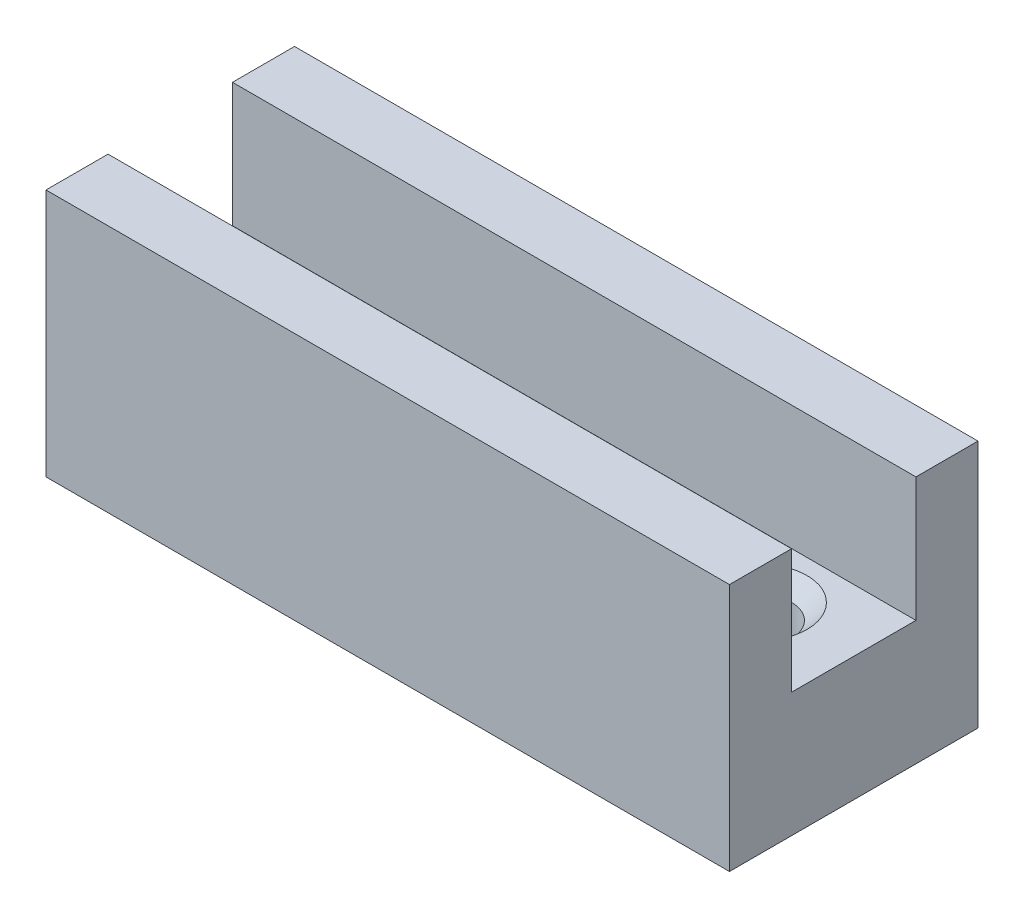
ISO-10303-21;
HEADER;
FILE_DESCRIPTION(('STEP AP214'),'2;1');
FILE_NAME('part.step','',(''),(''),'','','');
FILE_SCHEMA(('AUTOMOTIVE_DESIGN { 1 0 10303 214 1 1 1 1 }'));
ENDSEC;
DATA;
#1=APPLICATION_CONTEXT('core data for automotive mechanical design processes');
#2=APPLICATION_PROTOCOL_DEFINITION('international standard','automotive_design',2000,#1);
#3=PRODUCT_CONTEXT('',#1,'mechanical');
#4=PRODUCT('Part','Part','',(#3));
#5=PRODUCT_RELATED_PRODUCT_CATEGORY('part','',(#4));
#6=PRODUCT_DEFINITION_FORMATION('','',#4);
#7=PRODUCT_DEFINITION_CONTEXT('part definition',#1,'design');
#8=PRODUCT_DEFINITION('design','',#6,#7);
#9=PRODUCT_DEFINITION_SHAPE('','',#8);
#10=(LENGTH_UNIT() NAMED_UNIT(*) SI_UNIT(.MILLI.,.METRE.));
#11=(NAMED_UNIT(*) PLANE_ANGLE_UNIT() SI_UNIT($,.RADIAN.));
#12=(NAMED_UNIT(*) SI_UNIT($,.STERADIAN.) SOLID_ANGLE_UNIT());
#13=UNCERTAINTY_MEASURE_WITH_UNIT(LENGTH_MEASURE(1.E-05),#10,'distance_accuracy_value','');
#14=(GEOMETRIC_REPRESENTATION_CONTEXT(3) GLOBAL_UNCERTAINTY_ASSIGNED_CONTEXT((#13)) GLOBAL_UNIT_ASSIGNED_CONTEXT((#10,
#11,#12)) REPRESENTATION_CONTEXT('',''));
#15=CARTESIAN_POINT('',(0.,0.,0.));
#16=DIRECTION('',(0.,0.,1.));
#17=DIRECTION('',(1.,0.,0.));
#18=AXIS2_PLACEMENT_3D('',#15,#16,#17);
#19=CARTESIAN_POINT('',(0.,0.,101.6));
#20=DIRECTION('',(1.,0.,0.));
#21=DIRECTION('',(0.,0.,-1.));
#22=AXIS2_PLACEMENT_3D('',#19,#20,#21);
#23=PLANE('',#22);
#24=DIRECTION('',(0.,1.,0.));
#25=VECTOR('',#24,1.);
#26=CARTESIAN_POINT('',(0.,50.8,76.2340316643868));
#27=LINE('',#26,#25);
#28=CARTESIAN_POINT('',(0.,50.8,76.2340316643868));
#29=VERTEX_POINT('',#28);
#30=CARTESIAN_POINT('',(0.,101.6,76.2340316643868));
#31=VERTEX_POINT('',#30);
#32=EDGE_CURVE('E141',#29,#31,#27,.T.);
#33=ORIENTED_EDGE('',*,*,#32,.F.);
#34=DIRECTION('',(0.,0.,1.));
#35=VECTOR('',#34,1.);
#36=CARTESIAN_POINT('',(0.,50.8,0.));
#37=LINE('',#36,#35);
#38=CARTESIAN_POINT('',(0.,50.8,25.3659683356124));
#39=VERTEX_POINT('',#38);
#40=EDGE_CURVE('E119',#39,#29,#37,.T.);
#41=ORIENTED_EDGE('',*,*,#40,.F.);
#42=DIRECTION('',(0.,1.,0.));
#43=VECTOR('',#42,1.);
#44=CARTESIAN_POINT('',(0.,50.8,25.3659683356124));
#45=LINE('',#44,#43);
#46=CARTESIAN_POINT('',(0.,101.6,25.3659683356124));
#47=VERTEX_POINT('',#46);
#48=EDGE_CURVE('E144',#39,#47,#45,.T.);
#49=ORIENTED_EDGE('',*,*,#48,.T.);
#50=DIRECTION('',(0.,0.,-1.));
#51=VECTOR('',#50,1.);
#52=CARTESIAN_POINT('',(0.,101.6,101.6));
#53=LINE('',#52,#51);
#54=CARTESIAN_POINT('',(0.,101.6,0.));
#55=VERTEX_POINT('',#54);
#56=EDGE_CURVE('E79',#47,#55,#53,.T.);
#57=ORIENTED_EDGE('',*,*,#56,.T.);
#58=DIRECTION('',(0.,-1.,0.));
#59=VECTOR('',#58,1.);
#60=CARTESIAN_POINT('',(0.,0.,0.));
#61=LINE('',#60,#59);
#62=CARTESIAN_POINT('',(0.,0.,0.));
#63=VERTEX_POINT('',#62);
#64=EDGE_CURVE('E143',#55,#63,#61,.T.);
#65=ORIENTED_EDGE('',*,*,#64,.T.);
#66=DIRECTION('',(0.,0.,-1.));
#67=VECTOR('',#66,1.);
#68=CARTESIAN_POINT('',(0.,0.,101.6));
#69=LINE('',#68,#67);
#70=CARTESIAN_POINT('',(0.,0.,101.6));
#71=VERTEX_POINT('',#70);
#72=EDGE_CURVE('E170',#71,#63,#69,.T.);
#73=ORIENTED_EDGE('',*,*,#72,.F.);
#74=DIRECTION('',(0.,-1.,0.));
#75=VECTOR('',#74,1.);
#76=CARTESIAN_POINT('',(0.,0.,101.6));
#77=LINE('',#76,#75);
#78=CARTESIAN_POINT('',(0.,101.6,101.6));
#79=VERTEX_POINT('',#78);
#80=EDGE_CURVE('E147',#79,#71,#77,.T.);
#81=ORIENTED_EDGE('',*,*,#80,.F.);
#82=EDGE_CURVE('E161',#79,#31,#53,.T.);
#83=ORIENTED_EDGE('',*,*,#82,.T.);
#84=EDGE_LOOP('',(#33,#41,#49,#57,#65,#73,#81,#83));
#85=FACE_BOUND('',#84,.T.);
#86=ADVANCED_FACE('F33',(#85),#23,.F.);
#87=CARTESIAN_POINT('',(279.4,0.,101.6));
#88=DIRECTION('',(-1.,0.,0.));
#89=DIRECTION('',(0.,0.,1.));
#90=AXIS2_PLACEMENT_3D('',#87,#88,#89);
#91=PLANE('',#90);
#92=DIRECTION('',(0.,1.,0.));
#93=VECTOR('',#92,1.);
#94=CARTESIAN_POINT('',(279.4,50.8,76.2340316643868));
#95=LINE('',#94,#93);
#96=CARTESIAN_POINT('',(279.4,50.8,76.2340316643868));
#97=VERTEX_POINT('',#96);
#98=CARTESIAN_POINT('',(279.4,101.6,76.2340316643868));
#99=VERTEX_POINT('',#98);
#100=EDGE_CURVE('E108',#97,#99,#95,.T.);
#101=ORIENTED_EDGE('',*,*,#100,.T.);
#102=DIRECTION('',(0.,0.,-1.));
#103=VECTOR('',#102,1.);
#104=CARTESIAN_POINT('',(279.4,101.6,101.6));
#105=LINE('',#104,#103);
#106=CARTESIAN_POINT('',(279.4,101.6,101.6));
#107=VERTEX_POINT('',#106);
#108=EDGE_CURVE('E165',#107,#99,#105,.T.);
#109=ORIENTED_EDGE('',*,*,#108,.F.);
#110=DIRECTION('',(0.,1.,0.));
#111=VECTOR('',#110,1.);
#112=CARTESIAN_POINT('',(279.4,0.,101.6));
#113=LINE('',#112,#111);
#114=CARTESIAN_POINT('',(279.4,0.,101.6));
#115=VERTEX_POINT('',#114);
#116=EDGE_CURVE('E151',#115,#107,#113,.T.);
#117=ORIENTED_EDGE('',*,*,#116,.F.);
#118=DIRECTION('',(0.,0.,-1.));
#119=VECTOR('',#118,1.);
#120=CARTESIAN_POINT('',(279.4,0.,101.6));
#121=LINE('',#120,#119);
#122=CARTESIAN_POINT('',(279.4,0.,0.));
#123=VERTEX_POINT('',#122);
#124=EDGE_CURVE('E167',#115,#123,#121,.T.);
#125=ORIENTED_EDGE('',*,*,#124,.T.);
#126=DIRECTION('',(0.,1.,0.));
#127=VECTOR('',#126,1.);
#128=CARTESIAN_POINT('',(279.4,0.,0.));
#129=LINE('',#128,#127);
#130=CARTESIAN_POINT('',(279.4,101.6,0.));
#131=VERTEX_POINT('',#130);
#132=EDGE_CURVE('E157',#123,#131,#129,.T.);
#133=ORIENTED_EDGE('',*,*,#132,.T.);
#134=CARTESIAN_POINT('',(279.4,101.6,25.3659683356124));
#135=VERTEX_POINT('',#134);
#136=EDGE_CURVE('E164',#135,#131,#105,.T.);
#137=ORIENTED_EDGE('',*,*,#136,.F.);
#138=DIRECTION('',(0.,1.,0.));
#139=VECTOR('',#138,1.);
#140=CARTESIAN_POINT('',(279.4,50.8,25.3659683356124));
#141=LINE('',#140,#139);
#142=CARTESIAN_POINT('',(279.4,50.8,25.3659683356124));
#143=VERTEX_POINT('',#142);
#144=EDGE_CURVE('E48',#143,#135,#141,.T.);
#145=ORIENTED_EDGE('',*,*,#144,.F.);
#146=DIRECTION('',(0.,0.,-1.));
#147=VECTOR('',#146,1.);
#148=CARTESIAN_POINT('',(279.4,50.8,0.));
#149=LINE('',#148,#147);
#150=EDGE_CURVE('E125',#97,#143,#149,.T.);
#151=ORIENTED_EDGE('',*,*,#150,.F.);
#152=EDGE_LOOP('',(#101,#109,#117,#125,#133,#137,#145,#151));
#153=FACE_BOUND('',#152,.T.);
#154=ADVANCED_FACE('F130',(#153),#91,.F.);
#155=CARTESIAN_POINT('',(0.,101.6,101.6));
#156=DIRECTION('',(0.,-1.,0.));
#157=DIRECTION('',(0.,0.,-1.));
#158=AXIS2_PLACEMENT_3D('',#155,#156,#157);
#159=PLANE('',#158);
#160=DIRECTION('',(-1.,0.,0.));
#161=VECTOR('',#160,1.);
#162=CARTESIAN_POINT('',(0.,101.6,76.2340316643868));
#163=LINE('',#162,#161);
#164=EDGE_CURVE('E114',#99,#31,#163,.T.);
#165=ORIENTED_EDGE('',*,*,#164,.T.);
#166=ORIENTED_EDGE('',*,*,#82,.F.);
#167=DIRECTION('',(-1.,0.,0.));
#168=VECTOR('',#167,1.);
#169=CARTESIAN_POINT('',(0.,101.6,101.6));
#170=LINE('',#169,#168);
#171=EDGE_CURVE('E57',#107,#79,#170,.T.);
#172=ORIENTED_EDGE('',*,*,#171,.F.);
#173=ORIENTED_EDGE('',*,*,#108,.T.);
#174=EDGE_LOOP('',(#165,#166,#172,#173));
#175=FACE_BOUND('',#174,.T.);
#176=ADVANCED_FACE('F261',(#175),#159,.F.);
#177=DIRECTION('',(1.,0.,0.));
#178=VECTOR('',#177,1.);
#179=CARTESIAN_POINT('',(0.,101.6,25.3659683356124));
#180=LINE('',#179,#178);
#181=EDGE_CURVE('E128',#47,#135,#180,.T.);
#182=ORIENTED_EDGE('',*,*,#181,.T.);
#183=ORIENTED_EDGE('',*,*,#136,.T.);
#184=DIRECTION('',(-1.,0.,0.));
#185=VECTOR('',#184,1.);
#186=CARTESIAN_POINT('',(0.,101.6,0.));
#187=LINE('',#186,#185);
#188=EDGE_CURVE('E149',#131,#55,#187,.T.);
#189=ORIENTED_EDGE('',*,*,#188,.T.);
#190=ORIENTED_EDGE('',*,*,#56,.F.);
#191=EDGE_LOOP('',(#182,#183,#189,#190));
#192=FACE_BOUND('',#191,.T.);
#193=ADVANCED_FACE('F286',(#192),#159,.F.);
#194=CARTESIAN_POINT('',(0.,0.,101.6));
#195=DIRECTION('',(0.,1.,0.));
#196=DIRECTION('',(0.,0.,1.));
#197=AXIS2_PLACEMENT_3D('',#194,#195,#196);
#198=PLANE('',#197);
#199=CARTESIAN_POINT('',(139.7,0.,50.8));
#200=DIRECTION('',(0.,1.,0.));
#201=DIRECTION('',(0.,0.,1.));
#202=AXIS2_PLACEMENT_3D('',#199,#200,#201);
#203=CIRCLE('',#202,12.7);
#204=CARTESIAN_POINT('',(139.7,0.,63.5));
#205=VERTEX_POINT('',#204);
#206=EDGE_CURVE('E173',#205,#205,#203,.T.);
#207=ORIENTED_EDGE('',*,*,#206,.T.);
#208=EDGE_LOOP('',(#207));
#209=FACE_BOUND('',#208,.T.);
#210=CARTESIAN_POINT('',(38.1,0.,50.8));
#211=DIRECTION('',(0.,1.,0.));
#212=DIRECTION('',(0.,0.,1.));
#213=AXIS2_PLACEMENT_3D('',#210,#211,#212);
#214=CIRCLE('',#213,12.7);
#215=CARTESIAN_POINT('',(38.1,0.,63.5));
#216=VERTEX_POINT('',#215);
#217=EDGE_CURVE('E139',#216,#216,#214,.T.);
#218=ORIENTED_EDGE('',*,*,#217,.T.);
#219=EDGE_LOOP('',(#218));
#220=FACE_BOUND('',#219,.T.);
#221=CARTESIAN_POINT('',(88.9,0.,50.8));
#222=DIRECTION('',(0.,1.,0.));
#223=DIRECTION('',(0.,0.,1.));
#224=AXIS2_PLACEMENT_3D('',#221,#222,#223);
#225=CIRCLE('',#224,12.7);
#226=CARTESIAN_POINT('',(88.9,0.,63.5));
#227=VERTEX_POINT('',#226);
#228=EDGE_CURVE('E217',#227,#227,#225,.T.);
#229=ORIENTED_EDGE('',*,*,#228,.T.);
#230=EDGE_LOOP('',(#229));
#231=FACE_BOUND('',#230,.T.);
#232=CARTESIAN_POINT('',(190.5,0.,50.8));
#233=DIRECTION('',(0.,1.,0.));
#234=DIRECTION('',(0.,0.,1.));
#235=AXIS2_PLACEMENT_3D('',#232,#233,#234);
#236=CIRCLE('',#235,12.7);
#237=CARTESIAN_POINT('',(190.5,0.,63.4999999999999));
#238=VERTEX_POINT('',#237);
#239=EDGE_CURVE('E214',#238,#238,#236,.T.);
#240=ORIENTED_EDGE('',*,*,#239,.T.);
#241=EDGE_LOOP('',(#240));
#242=FACE_BOUND('',#241,.T.);
#243=CARTESIAN_POINT('',(241.3,0.,50.7999999999999));
#244=DIRECTION('',(0.,1.,0.));
#245=DIRECTION('',(0.,0.,1.));
#246=AXIS2_PLACEMENT_3D('',#243,#244,#245);
#247=CIRCLE('',#246,12.7);
#248=CARTESIAN_POINT('',(241.3,0.,63.4999999999999));
#249=VERTEX_POINT('',#248);
#250=EDGE_CURVE('E212',#249,#249,#247,.T.);
#251=ORIENTED_EDGE('',*,*,#250,.T.);
#252=EDGE_LOOP('',(#251));
#253=FACE_BOUND('',#252,.T.);
#254=DIRECTION('',(1.,0.,0.));
#255=VECTOR('',#254,1.);
#256=CARTESIAN_POINT('',(0.,0.,0.));
#257=LINE('',#256,#255);
#258=EDGE_CURVE('E155',#63,#123,#257,.T.);
#259=ORIENTED_EDGE('',*,*,#258,.T.);
#260=ORIENTED_EDGE('',*,*,#124,.F.);
#261=DIRECTION('',(1.,0.,0.));
#262=VECTOR('',#261,1.);
#263=CARTESIAN_POINT('',(0.,0.,101.6));
#264=LINE('',#263,#262);
#265=EDGE_CURVE('E87',#71,#115,#264,.T.);
#266=ORIENTED_EDGE('',*,*,#265,.F.);
#267=ORIENTED_EDGE('',*,*,#72,.T.);
#268=EDGE_LOOP('',(#259,#260,#266,#267));
#269=FACE_BOUND('',#268,.T.);
#270=ADVANCED_FACE('F265',(#209,#220,#231,#242,#253,#269),#198,.F.);
#271=CARTESIAN_POINT('',(0.,0.,101.6));
#272=DIRECTION('',(0.,0.,-1.));
#273=DIRECTION('',(-1.,0.,0.));
#274=AXIS2_PLACEMENT_3D('',#271,#272,#273);
#275=PLANE('',#274);
#276=ORIENTED_EDGE('',*,*,#80,.T.);
#277=ORIENTED_EDGE('',*,*,#265,.T.);
#278=ORIENTED_EDGE('',*,*,#116,.T.);
#279=ORIENTED_EDGE('',*,*,#171,.T.);
#280=EDGE_LOOP('',(#276,#277,#278,#279));
#281=FACE_BOUND('',#280,.T.);
#282=ADVANCED_FACE('F285',(#281),#275,.F.);
#283=CARTESIAN_POINT('',(0.,0.,0.));
#284=DIRECTION('',(0.,0.,-1.));
#285=DIRECTION('',(-1.,0.,0.));
#286=AXIS2_PLACEMENT_3D('',#283,#284,#285);
#287=PLANE('',#286);
#288=ORIENTED_EDGE('',*,*,#64,.F.);
#289=ORIENTED_EDGE('',*,*,#188,.F.);
#290=ORIENTED_EDGE('',*,*,#132,.F.);
#291=ORIENTED_EDGE('',*,*,#258,.F.);
#292=EDGE_LOOP('',(#288,#289,#290,#291));
#293=FACE_BOUND('',#292,.T.);
#294=ADVANCED_FACE('F297',(#293),#287,.T.);
#295=CARTESIAN_POINT('',(0.,50.8,76.2340316643868));
#296=DIRECTION('',(0.,0.,-1.));
#297=DIRECTION('',(-1.,0.,0.));
#298=AXIS2_PLACEMENT_3D('',#295,#296,#297);
#299=PLANE('',#298);
#300=ORIENTED_EDGE('',*,*,#164,.F.);
#301=ORIENTED_EDGE('',*,*,#100,.F.);
#302=DIRECTION('',(-1.,0.,0.));
#303=VECTOR('',#302,1.);
#304=CARTESIAN_POINT('',(0.,50.8,76.2340316643868));
#305=LINE('',#304,#303);
#306=EDGE_CURVE('E111',#97,#29,#305,.T.);
#307=ORIENTED_EDGE('',*,*,#306,.T.);
#308=ORIENTED_EDGE('',*,*,#32,.T.);
#309=EDGE_LOOP('',(#300,#301,#307,#308));
#310=FACE_BOUND('',#309,.T.);
#311=ADVANCED_FACE('F110',(#310),#299,.T.);
#312=CARTESIAN_POINT('',(0.,50.8,25.3659683356124));
#313=DIRECTION('',(0.,0.,1.));
#314=DIRECTION('',(1.,0.,0.));
#315=AXIS2_PLACEMENT_3D('',#312,#313,#314);
#316=PLANE('',#315);
#317=ORIENTED_EDGE('',*,*,#181,.F.);
#318=ORIENTED_EDGE('',*,*,#48,.F.);
#319=DIRECTION('',(1.,0.,0.));
#320=VECTOR('',#319,1.);
#321=CARTESIAN_POINT('',(0.,50.8,25.3659683356124));
#322=LINE('',#321,#320);
#323=EDGE_CURVE('E132',#39,#143,#322,.T.);
#324=ORIENTED_EDGE('',*,*,#323,.T.);
#325=ORIENTED_EDGE('',*,*,#144,.T.);
#326=EDGE_LOOP('',(#317,#318,#324,#325));
#327=FACE_BOUND('',#326,.T.);
#328=ADVANCED_FACE('F248',(#327),#316,.T.);
#329=CARTESIAN_POINT('',(0.,50.8,0.));
#330=DIRECTION('',(0.,1.,0.));
#331=DIRECTION('',(0.,0.,1.));
#332=AXIS2_PLACEMENT_3D('',#329,#330,#331);
#333=PLANE('',#332);
#334=CARTESIAN_POINT('',(241.3,50.8,50.7999999999999));
#335=DIRECTION('',(0.,1.,0.));
#336=DIRECTION('',(0.,0.,1.));
#337=AXIS2_PLACEMENT_3D('',#334,#335,#336);
#338=CIRCLE('',#337,19.0500000000001);
#339=CARTESIAN_POINT('',(241.3,50.8,69.8500000000001));
#340=VERTEX_POINT('',#339);
#341=EDGE_CURVE('E41',#340,#340,#338,.F.);
#342=ORIENTED_EDGE('',*,*,#341,.T.);
#343=EDGE_LOOP('',(#342));
#344=FACE_BOUND('',#343,.T.);
#345=CARTESIAN_POINT('',(190.5,50.8,50.8));
#346=DIRECTION('',(0.,1.,0.));
#347=DIRECTION('',(0.,0.,1.));
#348=AXIS2_PLACEMENT_3D('',#345,#346,#347);
#349=CIRCLE('',#348,19.0500000000001);
#350=CARTESIAN_POINT('',(190.5,50.8,69.85));
#351=VERTEX_POINT('',#350);
#352=EDGE_CURVE('E192',#351,#351,#349,.F.);
#353=ORIENTED_EDGE('',*,*,#352,.T.);
#354=EDGE_LOOP('',(#353));
#355=FACE_BOUND('',#354,.T.);
#356=CARTESIAN_POINT('',(88.9,50.8,50.8));
#357=DIRECTION('',(0.,1.,0.));
#358=DIRECTION('',(0.,0.,1.));
#359=AXIS2_PLACEMENT_3D('',#356,#357,#358);
#360=CIRCLE('',#359,19.05);
#361=CARTESIAN_POINT('',(88.9,50.8,69.85));
#362=VERTEX_POINT('',#361);
#363=EDGE_CURVE('E183',#362,#362,#360,.F.);
#364=ORIENTED_EDGE('',*,*,#363,.T.);
#365=EDGE_LOOP('',(#364));
#366=FACE_BOUND('',#365,.T.);
#367=CARTESIAN_POINT('',(38.1,50.8,50.8));
#368=DIRECTION('',(0.,1.,0.));
#369=DIRECTION('',(0.,0.,1.));
#370=AXIS2_PLACEMENT_3D('',#367,#368,#369);
#371=CIRCLE('',#370,19.05);
#372=CARTESIAN_POINT('',(38.1,50.8,69.85));
#373=VERTEX_POINT('',#372);
#374=EDGE_CURVE('E180',#373,#373,#371,.F.);
#375=ORIENTED_EDGE('',*,*,#374,.T.);
#376=EDGE_LOOP('',(#375));
#377=FACE_BOUND('',#376,.T.);
#378=CARTESIAN_POINT('',(139.7,50.8,50.8));
#379=DIRECTION('',(0.,1.,0.));
#380=DIRECTION('',(0.,0.,1.));
#381=AXIS2_PLACEMENT_3D('',#378,#379,#380);
#382=CIRCLE('',#381,19.05);
#383=CARTESIAN_POINT('',(139.7,50.8,69.85));
#384=VERTEX_POINT('',#383);
#385=EDGE_CURVE('E176',#384,#384,#382,.T.);
#386=ORIENTED_EDGE('',*,*,#385,.F.);
#387=EDGE_LOOP('',(#386));
#388=FACE_BOUND('',#387,.T.);
#389=ORIENTED_EDGE('',*,*,#306,.F.);
#390=ORIENTED_EDGE('',*,*,#150,.T.);
#391=ORIENTED_EDGE('',*,*,#323,.F.);
#392=ORIENTED_EDGE('',*,*,#40,.T.);
#393=EDGE_LOOP('',(#389,#390,#391,#392));
#394=FACE_BOUND('',#393,.T.);
#395=ADVANCED_FACE('F123',(#344,#355,#366,#377,#388,#394),#333,.T.);
#396=CARTESIAN_POINT('',(241.3,0.,50.7999999999999));
#397=DIRECTION('',(0.,1.,0.));
#398=DIRECTION('',(0.,0.,1.));
#399=AXIS2_PLACEMENT_3D('',#396,#397,#398);
#400=CYLINDRICAL_SURFACE('',#399,12.7);
#401=CARTESIAN_POINT('',(241.3,44.4499999999999,50.7999999999999));
#402=DIRECTION('',(0.,1.,0.));
#403=DIRECTION('',(0.,0.,1.));
#404=AXIS2_PLACEMENT_3D('',#401,#402,#403);
#405=CIRCLE('',#404,12.7);
#406=CARTESIAN_POINT('',(241.3,44.4499999999998,63.4999999999999));
#407=VERTEX_POINT('',#406);
#408=EDGE_CURVE('E189',#407,#407,#405,.T.);
#409=ORIENTED_EDGE('',*,*,#408,.T.);
#410=EDGE_LOOP('',(#409));
#411=FACE_BOUND('',#410,.T.);
#412=ORIENTED_EDGE('',*,*,#250,.F.);
#413=EDGE_LOOP('',(#412));
#414=FACE_BOUND('',#413,.T.);
#415=ADVANCED_FACE('F205',(#411,#414),#400,.F.);
#416=CARTESIAN_POINT('',(190.5,0.,50.8));
#417=DIRECTION('',(0.,1.,0.));
#418=DIRECTION('',(0.,0.,1.));
#419=AXIS2_PLACEMENT_3D('',#416,#417,#418);
#420=CYLINDRICAL_SURFACE('',#419,12.7);
#421=CARTESIAN_POINT('',(190.5,44.4499999999999,50.8));
#422=DIRECTION('',(0.,1.,0.));
#423=DIRECTION('',(0.,0.,1.));
#424=AXIS2_PLACEMENT_3D('',#421,#422,#423);
#425=CIRCLE('',#424,12.7);
#426=CARTESIAN_POINT('',(190.5,44.4499999999999,63.4999999999999));
#427=VERTEX_POINT('',#426);
#428=EDGE_CURVE('E11',#427,#427,#425,.T.);
#429=ORIENTED_EDGE('',*,*,#428,.T.);
#430=EDGE_LOOP('',(#429));
#431=FACE_BOUND('',#430,.T.);
#432=ORIENTED_EDGE('',*,*,#239,.F.);
#433=EDGE_LOOP('',(#432));
#434=FACE_BOUND('',#433,.T.);
#435=ADVANCED_FACE('F208',(#431,#434),#420,.F.);
#436=CARTESIAN_POINT('',(88.9,0.,50.8));
#437=DIRECTION('',(0.,1.,0.));
#438=DIRECTION('',(0.,0.,1.));
#439=AXIS2_PLACEMENT_3D('',#436,#437,#438);
#440=CYLINDRICAL_SURFACE('',#439,12.7);
#441=CARTESIAN_POINT('',(88.9,44.45,50.8));
#442=DIRECTION('',(0.,1.,0.));
#443=DIRECTION('',(0.,0.,1.));
#444=AXIS2_PLACEMENT_3D('',#441,#442,#443);
#445=CIRCLE('',#444,12.7);
#446=CARTESIAN_POINT('',(88.9,44.45,63.5));
#447=VERTEX_POINT('',#446);
#448=EDGE_CURVE('E172',#447,#447,#445,.T.);
#449=ORIENTED_EDGE('',*,*,#448,.T.);
#450=EDGE_LOOP('',(#449));
#451=FACE_BOUND('',#450,.T.);
#452=ORIENTED_EDGE('',*,*,#228,.F.);
#453=EDGE_LOOP('',(#452));
#454=FACE_BOUND('',#453,.T.);
#455=ADVANCED_FACE('F279',(#451,#454),#440,.F.);
#456=CARTESIAN_POINT('',(38.1,0.,50.8));
#457=DIRECTION('',(0.,1.,0.));
#458=DIRECTION('',(0.,0.,1.));
#459=AXIS2_PLACEMENT_3D('',#456,#457,#458);
#460=CYLINDRICAL_SURFACE('',#459,12.7);
#461=CARTESIAN_POINT('',(38.1,44.45,50.8));
#462=DIRECTION('',(0.,1.,0.));
#463=DIRECTION('',(0.,0.,1.));
#464=AXIS2_PLACEMENT_3D('',#461,#462,#463);
#465=CIRCLE('',#464,12.7);
#466=CARTESIAN_POINT('',(38.1,44.45,63.5));
#467=VERTEX_POINT('',#466);
#468=EDGE_CURVE('E186',#467,#467,#465,.T.);
#469=ORIENTED_EDGE('',*,*,#468,.T.);
#470=EDGE_LOOP('',(#469));
#471=FACE_BOUND('',#470,.T.);
#472=ORIENTED_EDGE('',*,*,#217,.F.);
#473=EDGE_LOOP('',(#472));
#474=FACE_BOUND('',#473,.T.);
#475=ADVANCED_FACE('F243',(#471,#474),#460,.F.);
#476=CARTESIAN_POINT('',(139.7,31.75,50.8));
#477=DIRECTION('',(0.,1.,0.));
#478=DIRECTION('',(0.,0.,1.));
#479=AXIS2_PLACEMENT_3D('',#476,#477,#478);
#480=CYLINDRICAL_SURFACE('',#479,19.05);
#481=CARTESIAN_POINT('',(139.7,31.75,50.8));
#482=DIRECTION('',(0.,1.,0.));
#483=DIRECTION('',(0.,0.,1.));
#484=AXIS2_PLACEMENT_3D('',#481,#482,#483);
#485=CIRCLE('',#484,19.05);
#486=CARTESIAN_POINT('',(139.7,31.75,69.85));
#487=VERTEX_POINT('',#486);
#488=EDGE_CURVE('E215',#487,#487,#485,.T.);
#489=CARTESIAN_POINT('',(139.7,31.75,69.85));
#490=CARTESIAN_POINT('',(139.7,31.9484375,69.85));
#491=CARTESIAN_POINT('',(139.7,32.146875,69.85));
#492=CARTESIAN_POINT('',(139.7,32.54375,69.85));
#493=CARTESIAN_POINT('',(139.7,32.7421875,69.85));
#494=CARTESIAN_POINT('',(139.7,33.1390625,69.85));
#495=CARTESIAN_POINT('',(139.7,33.3375,69.85));
#496=CARTESIAN_POINT('',(139.7,33.734375,69.85));
#497=CARTESIAN_POINT('',(139.7,33.9328125,69.85));
#498=CARTESIAN_POINT('',(139.7,34.3296875,69.85));
#499=CARTESIAN_POINT('',(139.7,34.528125,69.85));
#500=CARTESIAN_POINT('',(139.7,34.925,69.85));
#501=CARTESIAN_POINT('',(139.7,35.1234375,69.85));
#502=CARTESIAN_POINT('',(139.7,35.5203125,69.85));
#503=CARTESIAN_POINT('',(139.7,35.71875,69.85));
#504=CARTESIAN_POINT('',(139.7,36.115625,69.85));
#505=CARTESIAN_POINT('',(139.7,36.3140625,69.85));
#506=CARTESIAN_POINT('',(139.7,36.7109375,69.85));
#507=CARTESIAN_POINT('',(139.7,36.909375,69.85));
#508=CARTESIAN_POINT('',(139.7,37.30625,69.85));
#509=CARTESIAN_POINT('',(139.7,37.5046875,69.85));
#510=CARTESIAN_POINT('',(139.7,37.9015625,69.85));
#511=CARTESIAN_POINT('',(139.7,38.1,69.85));
#512=CARTESIAN_POINT('',(139.7,38.496875,69.85));
#513=CARTESIAN_POINT('',(139.7,38.6953125,69.85));
#514=CARTESIAN_POINT('',(139.7,39.0921875,69.85));
#515=CARTESIAN_POINT('',(139.7,39.290625,69.85));
#516=CARTESIAN_POINT('',(139.7,39.6875,69.85));
#517=CARTESIAN_POINT('',(139.7,39.8859375,69.85));
#518=CARTESIAN_POINT('',(139.7,40.2828125,69.85));
#519=CARTESIAN_POINT('',(139.7,40.48125,69.85));
#520=CARTESIAN_POINT('',(139.7,40.878125,69.85));
#521=CARTESIAN_POINT('',(139.7,41.0765625,69.85));
#522=CARTESIAN_POINT('',(139.7,41.4734375,69.85));
#523=CARTESIAN_POINT('',(139.7,41.671875,69.85));
#524=CARTESIAN_POINT('',(139.7,42.06875,69.85));
#525=CARTESIAN_POINT('',(139.7,42.2671875,69.85));
#526=CARTESIAN_POINT('',(139.7,42.6640625,69.85));
#527=CARTESIAN_POINT('',(139.7,42.8625,69.85));
#528=CARTESIAN_POINT('',(139.7,43.259375,69.85));
#529=CARTESIAN_POINT('',(139.7,43.4578125,69.85));
#530=CARTESIAN_POINT('',(139.7,43.8546875,69.85));
#531=CARTESIAN_POINT('',(139.7,44.053125,69.85));
#532=CARTESIAN_POINT('',(139.7,44.45,69.85));
#533=CARTESIAN_POINT('',(139.7,44.6484375,69.85));
#534=CARTESIAN_POINT('',(139.7,45.0453125,69.85));
#535=CARTESIAN_POINT('',(139.7,45.24375,69.85));
#536=CARTESIAN_POINT('',(139.7,45.640625,69.85));
#537=CARTESIAN_POINT('',(139.7,45.8390625,69.85));
#538=CARTESIAN_POINT('',(139.7,46.2359375,69.85));
#539=CARTESIAN_POINT('',(139.7,46.434375,69.85));
#540=CARTESIAN_POINT('',(139.7,46.83125,69.85));
#541=CARTESIAN_POINT('',(139.7,47.0296875,69.85));
#542=CARTESIAN_POINT('',(139.7,47.4265625,69.85));
#543=CARTESIAN_POINT('',(139.7,47.625,69.85));
#544=CARTESIAN_POINT('',(139.7,48.021875,69.85));
#545=CARTESIAN_POINT('',(139.7,48.2203125,69.85));
#546=CARTESIAN_POINT('',(139.7,48.6171875,69.85));
#547=CARTESIAN_POINT('',(139.7,48.815625,69.85));
#548=CARTESIAN_POINT('',(139.7,49.2125,69.85));
#549=CARTESIAN_POINT('',(139.7,49.4109375,69.85));
#550=CARTESIAN_POINT('',(139.7,49.8078125,69.85));
#551=CARTESIAN_POINT('',(139.7,50.00625,69.85));
#552=CARTESIAN_POINT('',(139.7,50.403125,69.85));
#553=CARTESIAN_POINT('',(139.7,50.6015625,69.85));
#554=CARTESIAN_POINT('',(139.7,50.8,69.85));
#555=B_SPLINE_CURVE_WITH_KNOTS('',3,(#489,#490,#491,#492,#493,#494,#495,#496,#497,#498,#499,
#500,#501,#502,#503,#504,#505,#506,#507,#508,#509,#510,#511,#512,#513,#514,#515,#516,#517,#518,
#519,#520,#521,#522,#523,#524,#525,#526,#527,#528,#529,#530,#531,#532,#533,#534,#535,#536,#537,
#538,#539,#540,#541,#542,#543,#544,#545,#546,#547,#548,#549,#550,#551,#552,#553,#554),
.UNSPECIFIED.,.F.,.F.,(4,2,2,2,2,2,2,2,2,2,2,2,2,2,2,2,2,2,2,2,2,2,2,2,2,2,2,2,2,2,2,2,4),(0.,
0.595312499999993,1.19062499999999,1.78593749999999,2.38124999999999,2.97656249999999,3.571875,
4.1671875,4.7625,5.3578125,5.953125,6.5484375,7.14375,7.7390625,8.33437499999999,
8.92968749999999,9.52499999999999,10.1203125,10.715625,11.3109375,11.90625,12.5015625,13.096875,
13.6921875,14.2875,14.8828125,15.478125,16.0734375,16.66875,17.2640625,17.859375,18.4546875,
19.05),.UNSPECIFIED.);
#556=EDGE_CURVE('BSEAM237',#487,#384,#555,.T.);
#557=ORIENTED_EDGE('',*,*,#488,.F.);
#558=ORIENTED_EDGE('',*,*,#385,.T.);
#559=ORIENTED_EDGE('',*,*,#556,.T.);
#560=ORIENTED_EDGE('',*,*,#556,.F.);
#561=EDGE_LOOP('',(#557,#559,#558,#560));
#562=FACE_BOUND('',#561,.T.);
#563=ADVANCED_FACE('F237',(#562),#480,.F.);
#564=CARTESIAN_POINT('',(139.7,31.75,50.8));
#565=DIRECTION('',(0.,1.,0.));
#566=DIRECTION('',(0.,0.,1.));
#567=AXIS2_PLACEMENT_3D('',#564,#565,#566);
#568=PLANE('',#567);
#569=CARTESIAN_POINT('',(139.7,31.75,50.8));
#570=DIRECTION('',(0.,1.,0.));
#571=DIRECTION('',(0.,0.,1.));
#572=AXIS2_PLACEMENT_3D('',#569,#570,#571);
#573=CIRCLE('',#572,12.7);
#574=CARTESIAN_POINT('',(139.7,31.75,63.5));
#575=VERTEX_POINT('',#574);
#576=EDGE_CURVE('E177',#575,#575,#573,.T.);
#577=ORIENTED_EDGE('',*,*,#576,.F.);
#578=EDGE_LOOP('',(#577));
#579=FACE_BOUND('',#578,.T.);
#580=ORIENTED_EDGE('',*,*,#488,.T.);
#581=EDGE_LOOP('',(#580));
#582=FACE_BOUND('',#581,.T.);
#583=ADVANCED_FACE('F234',(#579,#582),#568,.T.);
#584=CARTESIAN_POINT('',(139.7,-44.45,50.8));
#585=DIRECTION('',(0.,1.,0.));
#586=DIRECTION('',(0.,0.,1.));
#587=AXIS2_PLACEMENT_3D('',#584,#585,#586);
#588=CYLINDRICAL_SURFACE('',#587,12.7);
#589=CARTESIAN_POINT('',(139.7,31.75,63.5));
#590=CARTESIAN_POINT('',(139.7,31.4192708333333,63.5));
#591=CARTESIAN_POINT('',(139.7,31.0885416666667,63.5));
#592=CARTESIAN_POINT('',(139.7,30.4270833333333,63.5));
#593=CARTESIAN_POINT('',(139.7,30.0963541666667,63.5));
#594=CARTESIAN_POINT('',(139.7,29.4348958333333,63.5));
#595=CARTESIAN_POINT('',(139.7,29.1041666666667,63.5));
#596=CARTESIAN_POINT('',(139.7,28.4427083333333,63.5));
#597=CARTESIAN_POINT('',(139.7,28.1119791666667,63.5));
#598=CARTESIAN_POINT('',(139.7,27.4505208333333,63.5));
#599=CARTESIAN_POINT('',(139.7,27.1197916666667,63.5));
#600=CARTESIAN_POINT('',(139.7,26.4583333333333,63.5));
#601=CARTESIAN_POINT('',(139.7,26.1276041666667,63.5));
#602=CARTESIAN_POINT('',(139.7,25.4661458333333,63.5));
#603=CARTESIAN_POINT('',(139.7,25.1354166666667,63.5));
#604=CARTESIAN_POINT('',(139.7,24.4739583333333,63.5));
#605=CARTESIAN_POINT('',(139.7,24.1432291666667,63.5));
#606=CARTESIAN_POINT('',(139.7,23.4817708333333,63.5));
#607=CARTESIAN_POINT('',(139.7,23.1510416666667,63.5));
#608=CARTESIAN_POINT('',(139.7,22.4895833333333,63.5));
#609=CARTESIAN_POINT('',(139.7,22.1588541666667,63.5));
#610=CARTESIAN_POINT('',(139.7,21.4973958333333,63.5));
#611=CARTESIAN_POINT('',(139.7,21.1666666666667,63.5));
#612=CARTESIAN_POINT('',(139.7,20.5052083333333,63.5));
#613=CARTESIAN_POINT('',(139.7,20.1744791666667,63.5));
#614=CARTESIAN_POINT('',(139.7,19.5130208333333,63.5));
#615=CARTESIAN_POINT('',(139.7,19.1822916666667,63.5));
#616=CARTESIAN_POINT('',(139.7,18.5208333333333,63.5));
#617=CARTESIAN_POINT('',(139.7,18.1901041666667,63.5));
#618=CARTESIAN_POINT('',(139.7,17.5286458333333,63.5));
#619=CARTESIAN_POINT('',(139.7,17.1979166666667,63.5));
#620=CARTESIAN_POINT('',(139.7,16.5364583333333,63.5));
#621=CARTESIAN_POINT('',(139.7,16.2057291666667,63.5));
#622=CARTESIAN_POINT('',(139.7,15.5442708333333,63.5));
#623=CARTESIAN_POINT('',(139.7,15.2135416666667,63.5));
#624=CARTESIAN_POINT('',(139.7,14.5520833333333,63.5));
#625=CARTESIAN_POINT('',(139.7,14.2213541666667,63.5));
#626=CARTESIAN_POINT('',(139.7,13.5598958333333,63.5));
#627=CARTESIAN_POINT('',(139.7,13.2291666666667,63.5));
#628=CARTESIAN_POINT('',(139.7,12.5677083333333,63.5));
#629=CARTESIAN_POINT('',(139.7,12.2369791666667,63.5));
#630=CARTESIAN_POINT('',(139.7,11.5755208333333,63.5));
#631=CARTESIAN_POINT('',(139.7,11.2447916666667,63.5));
#632=CARTESIAN_POINT('',(139.7,10.5833333333333,63.5));
#633=CARTESIAN_POINT('',(139.7,10.2526041666667,63.5));
#634=CARTESIAN_POINT('',(139.7,9.59114583333333,63.5));
#635=CARTESIAN_POINT('',(139.7,9.26041666666666,63.5));
#636=CARTESIAN_POINT('',(139.7,8.59895833333333,63.5));
#637=CARTESIAN_POINT('',(139.7,8.26822916666666,63.5));
#638=CARTESIAN_POINT('',(139.7,7.60677083333333,63.5));
#639=CARTESIAN_POINT('',(139.7,7.27604166666666,63.5));
#640=CARTESIAN_POINT('',(139.7,6.61458333333333,63.5));
#641=CARTESIAN_POINT('',(139.7,6.28385416666666,63.5));
#642=CARTESIAN_POINT('',(139.7,5.62239583333333,63.5));
#643=CARTESIAN_POINT('',(139.7,5.29166666666666,63.5));
#644=CARTESIAN_POINT('',(139.7,4.63020833333333,63.5));
#645=CARTESIAN_POINT('',(139.7,4.29947916666666,63.5));
#646=CARTESIAN_POINT('',(139.7,3.63802083333333,63.5));
#647=CARTESIAN_POINT('',(139.7,3.30729166666666,63.5));
#648=CARTESIAN_POINT('',(139.7,2.64583333333333,63.5));
#649=CARTESIAN_POINT('',(139.7,2.31510416666666,63.5));
#650=CARTESIAN_POINT('',(139.7,1.65364583333333,63.5));
#651=CARTESIAN_POINT('',(139.7,1.32291666666666,63.5));
#652=CARTESIAN_POINT('',(139.7,0.66145833333333,63.5));
#653=CARTESIAN_POINT('',(139.7,0.330729166666662,63.5));
#654=CARTESIAN_POINT('',(139.7,0.,63.5));
#655=B_SPLINE_CURVE_WITH_KNOTS('',3,(#589,#590,#591,#592,#593,#594,#595,#596,#597,#598,#599,
#600,#601,#602,#603,#604,#605,#606,#607,#608,#609,#610,#611,#612,#613,#614,#615,#616,#617,#618,
#619,#620,#621,#622,#623,#624,#625,#626,#627,#628,#629,#630,#631,#632,#633,#634,#635,#636,#637,
#638,#639,#640,#641,#642,#643,#644,#645,#646,#647,#648,#649,#650,#651,#652,#653,#654),
.UNSPECIFIED.,.F.,.F.,(4,2,2,2,2,2,2,2,2,2,2,2,2,2,2,2,2,2,2,2,2,2,2,2,2,2,2,2,2,2,2,2,4),(0.,
0.992187500000005,1.984375,2.9765625,3.96875000000001,4.9609375,5.953125,6.94531250000001,
7.9375,8.92968750000001,9.921875,10.9140625,11.90625,12.8984375,13.890625,14.8828125,15.875,
16.8671875,17.859375,18.8515625,19.84375,20.8359375,21.828125,22.8203125,23.8125,24.8046875,
25.796875,26.7890625,27.78125,28.7734375,29.765625,30.7578125,31.75),.UNSPECIFIED.);
#656=EDGE_CURVE('BSEAM231',#575,#205,#655,.T.);
#657=ORIENTED_EDGE('',*,*,#576,.T.);
#658=ORIENTED_EDGE('',*,*,#206,.F.);
#659=ORIENTED_EDGE('',*,*,#656,.T.);
#660=ORIENTED_EDGE('',*,*,#656,.F.);
#661=EDGE_LOOP('',(#657,#659,#658,#660));
#662=FACE_BOUND('',#661,.T.);
#663=ADVANCED_FACE('F231',(#662),#588,.F.);
#664=CARTESIAN_POINT('',(88.9,44.45,50.8));
#665=DIRECTION('',(0.,1.,0.));
#666=DIRECTION('',(0.,0.,1.));
#667=AXIS2_PLACEMENT_3D('',#664,#665,#666);
#668=TOROIDAL_SURFACE('',#667,19.05,6.35);
#669=ORIENTED_EDGE('',*,*,#363,.F.);
#670=EDGE_LOOP('',(#669));
#671=FACE_BOUND('',#670,.T.);
#672=ORIENTED_EDGE('',*,*,#448,.F.);
#673=EDGE_LOOP('',(#672));
#674=FACE_BOUND('',#673,.T.);
#675=ADVANCED_FACE('F266',(#671,#674),#668,.T.);
#676=CARTESIAN_POINT('',(38.1,44.45,50.8));
#677=DIRECTION('',(0.,1.,0.));
#678=DIRECTION('',(0.,0.,1.));
#679=AXIS2_PLACEMENT_3D('',#676,#677,#678);
#680=TOROIDAL_SURFACE('',#679,19.05,6.35);
#681=ORIENTED_EDGE('',*,*,#374,.F.);
#682=EDGE_LOOP('',(#681));
#683=FACE_BOUND('',#682,.T.);
#684=ORIENTED_EDGE('',*,*,#468,.F.);
#685=EDGE_LOOP('',(#684));
#686=FACE_BOUND('',#685,.T.);
#687=ADVANCED_FACE('F202',(#683,#686),#680,.T.);
#688=CARTESIAN_POINT('',(241.3,44.4499999999999,50.7999999999999));
#689=DIRECTION('',(0.,1.,0.));
#690=DIRECTION('',(0.,0.,1.));
#691=AXIS2_PLACEMENT_3D('',#688,#689,#690);
#692=CONICAL_SURFACE('',#691,12.7,0.785398163397449);
#693=CARTESIAN_POINT('',(241.3,50.8,69.8500000000001));
#694=CARTESIAN_POINT('',(241.3,50.7338541666667,69.7838541666668));
#695=CARTESIAN_POINT('',(241.3,50.6677083333333,69.7177083333334));
#696=CARTESIAN_POINT('',(241.3,50.5354166666666,69.5854166666667));
#697=CARTESIAN_POINT('',(241.3,50.4692708333333,69.5192708333334));
#698=CARTESIAN_POINT('',(241.3,50.3369791666667,69.3869791666667));
#699=CARTESIAN_POINT('',(241.3,50.2708333333333,69.3208333333334));
#700=CARTESIAN_POINT('',(241.3,50.1385416666666,69.1885416666667));
#701=CARTESIAN_POINT('',(241.3,50.0723958333333,69.1223958333334));
#702=CARTESIAN_POINT('',(241.3,49.9401041666666,68.9901041666667));
#703=CARTESIAN_POINT('',(241.3,49.8739583333333,68.9239583333334));
#704=CARTESIAN_POINT('',(241.3,49.7416666666666,68.7916666666667));
#705=CARTESIAN_POINT('',(241.3,49.6755208333333,68.7255208333334));
#706=CARTESIAN_POINT('',(241.3,49.5432291666666,68.5932291666667));
#707=CARTESIAN_POINT('',(241.3,49.4770833333333,68.5270833333334));
#708=CARTESIAN_POINT('',(241.3,49.3447916666666,68.3947916666667));
#709=CARTESIAN_POINT('',(241.3,49.2786458333333,68.3286458333334));
#710=CARTESIAN_POINT('',(241.3,49.1463541666666,68.1963541666667));
#711=CARTESIAN_POINT('',(241.3,49.0802083333333,68.1302083333334));
#712=CARTESIAN_POINT('',(241.3,48.9479166666666,67.9979166666667));
#713=CARTESIAN_POINT('',(241.3,48.8817708333333,67.9317708333334));
#714=CARTESIAN_POINT('',(241.3,48.7494791666666,67.7994791666667));
#715=CARTESIAN_POINT('',(241.3,48.6833333333333,67.7333333333334));
#716=CARTESIAN_POINT('',(241.3,48.5510416666666,67.6010416666667));
#717=CARTESIAN_POINT('',(241.3,48.4848958333333,67.5348958333334));
#718=CARTESIAN_POINT('',(241.3,48.3526041666666,67.4026041666667));
#719=CARTESIAN_POINT('',(241.3,48.2864583333333,67.3364583333334));
#720=CARTESIAN_POINT('',(241.3,48.1541666666666,67.2041666666667));
#721=CARTESIAN_POINT('',(241.3,48.0880208333333,67.1380208333334));
#722=CARTESIAN_POINT('',(241.3,47.9557291666666,67.0057291666667));
#723=CARTESIAN_POINT('',(241.3,47.8895833333333,66.9395833333334));
#724=CARTESIAN_POINT('',(241.3,47.7572916666666,66.8072916666667));
#725=CARTESIAN_POINT('',(241.3,47.6911458333333,66.7411458333333));
#726=CARTESIAN_POINT('',(241.3,47.5588541666666,66.6088541666667));
#727=CARTESIAN_POINT('',(241.3,47.4927083333333,66.5427083333333));
#728=CARTESIAN_POINT('',(241.3,47.3604166666666,66.4104166666667));
#729=CARTESIAN_POINT('',(241.3,47.2942708333333,66.3442708333333));
#730=CARTESIAN_POINT('',(241.3,47.1619791666666,66.2119791666667));
#731=CARTESIAN_POINT('',(241.3,47.0958333333332,66.1458333333333));
#732=CARTESIAN_POINT('',(241.3,46.9635416666666,66.0135416666667));
#733=CARTESIAN_POINT('',(241.3,46.8973958333332,65.9473958333333));
#734=CARTESIAN_POINT('',(241.3,46.7651041666666,65.8151041666667));
#735=CARTESIAN_POINT('',(241.3,46.6989583333332,65.7489583333333));
#736=CARTESIAN_POINT('',(241.3,46.5666666666666,65.6166666666667));
#737=CARTESIAN_POINT('',(241.3,46.5005208333332,65.5505208333333));
#738=CARTESIAN_POINT('',(241.3,46.3682291666666,65.4182291666666));
#739=CARTESIAN_POINT('',(241.3,46.3020833333332,65.3520833333333));
#740=CARTESIAN_POINT('',(241.3,46.1697916666665,65.2197916666666));
#741=CARTESIAN_POINT('',(241.3,46.1036458333332,65.1536458333333));
#742=CARTESIAN_POINT('',(241.3,45.9713541666666,65.0213541666666));
#743=CARTESIAN_POINT('',(241.3,45.9052083333332,64.9552083333333));
#744=CARTESIAN_POINT('',(241.3,45.7729166666665,64.8229166666666));
#745=CARTESIAN_POINT('',(241.3,45.7067708333332,64.7567708333333));
#746=CARTESIAN_POINT('',(241.3,45.5744791666665,64.6244791666666));
#747=CARTESIAN_POINT('',(241.3,45.5083333333332,64.5583333333333));
#748=CARTESIAN_POINT('',(241.3,45.3760416666665,64.4260416666666));
#749=CARTESIAN_POINT('',(241.3,45.3098958333332,64.3598958333333));
#750=CARTESIAN_POINT('',(241.3,45.1776041666665,64.2276041666666));
#751=CARTESIAN_POINT('',(241.3,45.1114583333332,64.1614583333333));
#752=CARTESIAN_POINT('',(241.3,44.9791666666665,64.0291666666666));
#753=CARTESIAN_POINT('',(241.3,44.9130208333332,63.9630208333333));
#754=CARTESIAN_POINT('',(241.3,44.7807291666665,63.8307291666666));
#755=CARTESIAN_POINT('',(241.3,44.7145833333332,63.7645833333333));
#756=CARTESIAN_POINT('',(241.3,44.5822916666665,63.6322916666666));
#757=CARTESIAN_POINT('',(241.3,44.5161458333332,63.5661458333333));
#758=CARTESIAN_POINT('',(241.3,44.4499999999999,63.4999999999999));
#759=B_SPLINE_CURVE_WITH_KNOTS('',3,(#693,#694,#695,#696,#697,#698,#699,#700,#701,#702,#703,
#704,#705,#706,#707,#708,#709,#710,#711,#712,#713,#714,#715,#716,#717,#718,#719,#720,#721,#722,
#723,#724,#725,#726,#727,#728,#729,#730,#731,#732,#733,#734,#735,#736,#737,#738,#739,#740,#741,
#742,#743,#744,#745,#746,#747,#748,#749,#750,#751,#752,#753,#754,#755,#756,#757,#758),
.UNSPECIFIED.,.F.,.F.,(4,2,2,2,2,2,2,2,2,2,2,2,2,2,2,2,2,2,2,2,2,2,2,2,2,2,2,2,2,2,2,2,4),(0.,
0.280633003783419,0.561266007566829,0.841899011350253,1.12253201513367,1.40316501891709,
1.6837980227005,1.96443102648393,2.24506403026735,2.52569703405076,2.80633003783418,
3.0869630416176,3.36759604540102,3.64822904918443,3.92886205296785,4.20949505675126,
4.49012806053469,4.77076106431811,5.05139406810153,5.33202707188494,5.61266007566836,
5.89329307945177,6.17392608323519,6.45455908701861,6.73519209080203,7.01582509458544,
7.29645809836887,7.57709110215229,7.8577241059357,8.13835710971912,8.41899011350254,
8.69962311728596,8.98025612106937),.UNSPECIFIED.);
#760=EDGE_CURVE('BSEAM199',#340,#407,#759,.T.);
#761=ORIENTED_EDGE('',*,*,#341,.F.);
#762=ORIENTED_EDGE('',*,*,#408,.F.);
#763=ORIENTED_EDGE('',*,*,#760,.T.);
#764=ORIENTED_EDGE('',*,*,#760,.F.);
#765=EDGE_LOOP('',(#761,#763,#762,#764));
#766=FACE_BOUND('',#765,.T.);
#767=ADVANCED_FACE('F199',(#766),#692,.F.);
#768=CARTESIAN_POINT('',(190.5,44.4499999999999,50.8));
#769=DIRECTION('',(0.,1.,0.));
#770=DIRECTION('',(0.,0.,1.));
#771=AXIS2_PLACEMENT_3D('',#768,#769,#770);
#772=CONICAL_SURFACE('',#771,12.7,0.785398163397449);
#773=ORIENTED_EDGE('',*,*,#352,.F.);
#774=EDGE_LOOP('',(#773));
#775=FACE_BOUND('',#774,.T.);
#776=ORIENTED_EDGE('',*,*,#428,.F.);
#777=EDGE_LOOP('',(#776));
#778=FACE_BOUND('',#777,.T.);
#779=ADVANCED_FACE('F35',(#775,#778),#772,.F.);
#780=CLOSED_SHELL('',(#86,#154,#176,#193,#270,#282,#294,#311,#328,#395,#415,#435,#455,#475,#563,
#583,#663,#675,#687,#767,#779));
#781=MANIFOLD_SOLID_BREP('B2',#780);
#782=ADVANCED_BREP_SHAPE_REPRESENTATION('',(#18,#781),#14);
#783=SHAPE_DEFINITION_REPRESENTATION(#9,#782);
ENDSEC;
END-ISO-10303-21;
